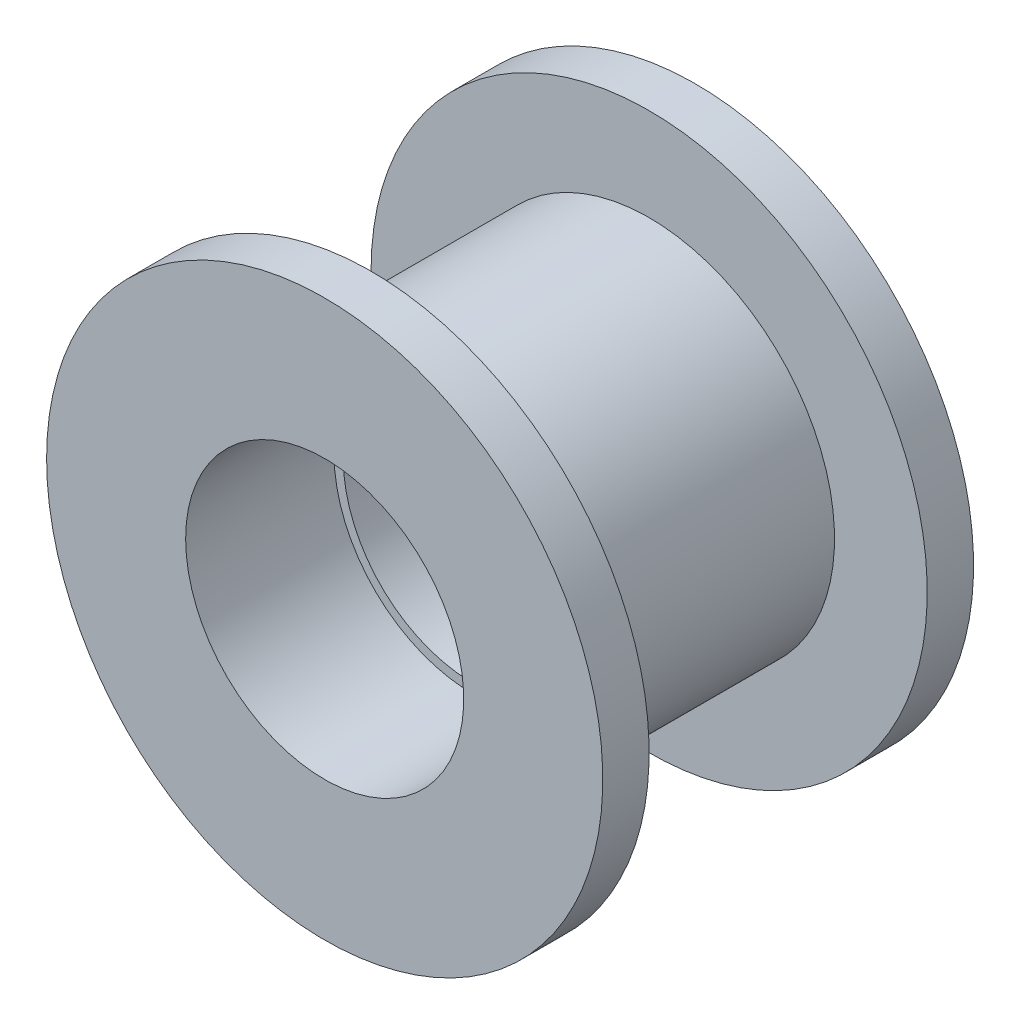
ISO-10303-21;
HEADER;
FILE_DESCRIPTION(('STEP AP214'),'2;1');
FILE_NAME('part.step','',(''),(''),'','','');
FILE_SCHEMA(('AUTOMOTIVE_DESIGN { 1 0 10303 214 1 1 1 1 }'));
ENDSEC;
DATA;
#1=APPLICATION_CONTEXT('core data for automotive mechanical design processes');
#2=APPLICATION_PROTOCOL_DEFINITION('international standard','automotive_design',2000,#1);
#3=PRODUCT_CONTEXT('',#1,'mechanical');
#4=PRODUCT('Part','Part','',(#3));
#5=PRODUCT_RELATED_PRODUCT_CATEGORY('part','',(#4));
#6=PRODUCT_DEFINITION_FORMATION('','',#4);
#7=PRODUCT_DEFINITION_CONTEXT('part definition',#1,'design');
#8=PRODUCT_DEFINITION('design','',#6,#7);
#9=PRODUCT_DEFINITION_SHAPE('','',#8);
#10=(LENGTH_UNIT() NAMED_UNIT(*) SI_UNIT(.MILLI.,.METRE.));
#11=(NAMED_UNIT(*) PLANE_ANGLE_UNIT() SI_UNIT($,.RADIAN.));
#12=(NAMED_UNIT(*) SI_UNIT($,.STERADIAN.) SOLID_ANGLE_UNIT());
#13=UNCERTAINTY_MEASURE_WITH_UNIT(LENGTH_MEASURE(1.E-05),#10,'distance_accuracy_value','');
#14=(GEOMETRIC_REPRESENTATION_CONTEXT(3) GLOBAL_UNCERTAINTY_ASSIGNED_CONTEXT((#13)) GLOBAL_UNIT_ASSIGNED_CONTEXT((#10,
#11,#12)) REPRESENTATION_CONTEXT('',''));
#15=CARTESIAN_POINT('',(0.,0.,0.));
#16=DIRECTION('',(0.,0.,1.));
#17=DIRECTION('',(1.,0.,0.));
#18=AXIS2_PLACEMENT_3D('',#15,#16,#17);
#19=CARTESIAN_POINT('',(0.,0.,-89.8571428571429));
#20=DIRECTION('',(0.,0.,-1.));
#21=DIRECTION('',(-1.,0.,0.));
#22=AXIS2_PLACEMENT_3D('',#19,#20,#21);
#23=CYLINDRICAL_SURFACE('',#22,14.);
#24=CARTESIAN_POINT('',(0.,0.,-16.));
#25=DIRECTION('',(0.,0.,-1.));
#26=DIRECTION('',(-1.,0.,0.));
#27=AXIS2_PLACEMENT_3D('',#24,#25,#26);
#28=CIRCLE('',#27,14.);
#29=CARTESIAN_POINT('',(-14.,0.,-16.));
#30=VERTEX_POINT('',#29);
#31=EDGE_CURVE('E11',#30,#30,#28,.T.);
#32=ORIENTED_EDGE('',*,*,#31,.F.);
#33=EDGE_LOOP('',(#32));
#34=FACE_BOUND('',#33,.T.);
#35=DIRECTION('',(0.,0.,-1.));
#36=VECTOR('',#35,1.);
#37=CARTESIAN_POINT('',(-4.,13.4164078649987,-24.));
#38=LINE('',#37,#36);
#39=CARTESIAN_POINT('',(-4.,13.4164078649987,-24.));
#40=VERTEX_POINT('',#39);
#41=CARTESIAN_POINT('',(-4.,13.4164078649987,-40.));
#42=VERTEX_POINT('',#41);
#43=EDGE_CURVE('E99',#40,#42,#38,.T.);
#44=ORIENTED_EDGE('',*,*,#43,.F.);
#45=CARTESIAN_POINT('',(0.,0.,-24.));
#46=DIRECTION('',(0.,0.,-1.));
#47=DIRECTION('',(-1.,0.,0.));
#48=AXIS2_PLACEMENT_3D('',#45,#46,#47);
#49=CIRCLE('',#48,14.);
#50=CARTESIAN_POINT('',(4.,13.4164078649987,-24.));
#51=VERTEX_POINT('',#50);
#52=EDGE_CURVE('E102',#51,#40,#49,.F.);
#53=ORIENTED_EDGE('',*,*,#52,.F.);
#54=DIRECTION('',(0.,0.,-1.));
#55=VECTOR('',#54,1.);
#56=CARTESIAN_POINT('',(4.,13.4164078649987,-24.));
#57=LINE('',#56,#55);
#58=CARTESIAN_POINT('',(4.,13.4164078649987,-40.));
#59=VERTEX_POINT('',#58);
#60=EDGE_CURVE('E88',#51,#59,#57,.T.);
#61=ORIENTED_EDGE('',*,*,#60,.T.);
#62=CARTESIAN_POINT('',(0.,0.,-40.));
#63=DIRECTION('',(0.,0.,-1.));
#64=DIRECTION('',(-1.,0.,0.));
#65=AXIS2_PLACEMENT_3D('',#62,#63,#64);
#66=CIRCLE('',#65,14.);
#67=EDGE_CURVE('E48',#59,#42,#66,.T.);
#68=ORIENTED_EDGE('',*,*,#67,.T.);
#69=EDGE_LOOP('',(#44,#53,#61,#68));
#70=FACE_BOUND('',#69,.T.);
#71=ADVANCED_FACE('F39',(#34,#70),#23,.F.);
#72=CARTESIAN_POINT('',(30.,0.,-40.));
#73=DIRECTION('',(0.,0.,1.));
#74=DIRECTION('',(1.,0.,0.));
#75=AXIS2_PLACEMENT_3D('',#72,#73,#74);
#76=PLANE('',#75);
#77=CARTESIAN_POINT('',(0.,0.,-40.));
#78=DIRECTION('',(0.,0.,-1.));
#79=DIRECTION('',(-1.,0.,0.));
#80=AXIS2_PLACEMENT_3D('',#77,#78,#79);
#81=CIRCLE('',#80,30.);
#82=CARTESIAN_POINT('',(-30.,0.,-40.));
#83=VERTEX_POINT('',#82);
#84=EDGE_CURVE('E154',#83,#83,#81,.T.);
#85=ORIENTED_EDGE('',*,*,#84,.T.);
#86=EDGE_LOOP('',(#85));
#87=FACE_BOUND('',#86,.T.);
#88=DIRECTION('',(0.,-1.,0.));
#89=VECTOR('',#88,1.);
#90=CARTESIAN_POINT('',(-4.,0.,-40.));
#91=LINE('',#90,#89);
#92=CARTESIAN_POINT('',(-4.,17.3,-40.));
#93=VERTEX_POINT('',#92);
#94=EDGE_CURVE('E81',#93,#42,#91,.T.);
#95=ORIENTED_EDGE('',*,*,#94,.T.);
#96=ORIENTED_EDGE('',*,*,#67,.F.);
#97=DIRECTION('',(0.,-1.,0.));
#98=VECTOR('',#97,1.);
#99=CARTESIAN_POINT('',(4.,0.,-40.));
#100=LINE('',#99,#98);
#101=CARTESIAN_POINT('',(4.,17.3,-40.));
#102=VERTEX_POINT('',#101);
#103=EDGE_CURVE('E93',#102,#59,#100,.T.);
#104=ORIENTED_EDGE('',*,*,#103,.F.);
#105=DIRECTION('',(-1.,0.,0.));
#106=VECTOR('',#105,1.);
#107=CARTESIAN_POINT('',(0.,17.3,-40.));
#108=LINE('',#107,#106);
#109=EDGE_CURVE('E55',#102,#93,#108,.T.);
#110=ORIENTED_EDGE('',*,*,#109,.T.);
#111=EDGE_LOOP('',(#95,#96,#104,#110));
#112=FACE_BOUND('',#111,.T.);
#113=ADVANCED_FACE('F159',(#87,#112),#76,.F.);
#114=CARTESIAN_POINT('',(14.,0.,-16.));
#115=DIRECTION('',(0.,0.,-1.));
#116=DIRECTION('',(-1.,0.,0.));
#117=AXIS2_PLACEMENT_3D('',#114,#115,#116);
#118=PLANE('',#117);
#119=CARTESIAN_POINT('',(0.,0.,-16.));
#120=DIRECTION('',(0.,0.,-1.));
#121=DIRECTION('',(-1.,0.,0.));
#122=AXIS2_PLACEMENT_3D('',#119,#120,#121);
#123=CIRCLE('',#122,15.);
#124=CARTESIAN_POINT('',(-15.,0.,-16.));
#125=VERTEX_POINT('',#124);
#126=EDGE_CURVE('E122',#125,#125,#123,.T.);
#127=ORIENTED_EDGE('',*,*,#126,.F.);
#128=EDGE_LOOP('',(#127));
#129=FACE_BOUND('',#128,.T.);
#130=ORIENTED_EDGE('',*,*,#31,.T.);
#131=EDGE_LOOP('',(#130));
#132=FACE_BOUND('',#131,.T.);
#133=ADVANCED_FACE('F41',(#129,#132),#118,.F.);
#134=CARTESIAN_POINT('',(0.,0.,-89.8571428571429));
#135=DIRECTION('',(0.,0.,-1.));
#136=DIRECTION('',(-1.,0.,0.));
#137=AXIS2_PLACEMENT_3D('',#134,#135,#136);
#138=CYLINDRICAL_SURFACE('',#137,30.);
#139=ORIENTED_EDGE('',*,*,#84,.F.);
#140=EDGE_LOOP('',(#139));
#141=FACE_BOUND('',#140,.T.);
#142=CARTESIAN_POINT('',(0.,0.,-35.));
#143=DIRECTION('',(0.,0.,-1.));
#144=DIRECTION('',(-1.,0.,0.));
#145=AXIS2_PLACEMENT_3D('',#142,#143,#144);
#146=CIRCLE('',#145,30.);
#147=CARTESIAN_POINT('',(-30.,0.,-35.));
#148=VERTEX_POINT('',#147);
#149=EDGE_CURVE('E150',#148,#148,#146,.T.);
#150=ORIENTED_EDGE('',*,*,#149,.T.);
#151=EDGE_LOOP('',(#150));
#152=FACE_BOUND('',#151,.T.);
#153=ADVANCED_FACE('F167',(#141,#152),#138,.T.);
#154=CARTESIAN_POINT('',(20.,0.,-35.));
#155=DIRECTION('',(0.,0.,-1.));
#156=DIRECTION('',(-1.,0.,0.));
#157=AXIS2_PLACEMENT_3D('',#154,#155,#156);
#158=PLANE('',#157);
#159=ORIENTED_EDGE('',*,*,#149,.F.);
#160=EDGE_LOOP('',(#159));
#161=FACE_BOUND('',#160,.T.);
#162=CARTESIAN_POINT('',(0.,0.,-35.));
#163=DIRECTION('',(0.,0.,-1.));
#164=DIRECTION('',(-1.,0.,0.));
#165=AXIS2_PLACEMENT_3D('',#162,#163,#164);
#166=CIRCLE('',#165,20.);
#167=CARTESIAN_POINT('',(-20.,0.,-35.));
#168=VERTEX_POINT('',#167);
#169=EDGE_CURVE('E146',#168,#168,#166,.T.);
#170=ORIENTED_EDGE('',*,*,#169,.T.);
#171=EDGE_LOOP('',(#170));
#172=FACE_BOUND('',#171,.T.);
#173=ADVANCED_FACE('F173',(#161,#172),#158,.F.);
#174=CARTESIAN_POINT('',(0.,0.,-89.8571428571429));
#175=DIRECTION('',(0.,0.,-1.));
#176=DIRECTION('',(-1.,0.,0.));
#177=AXIS2_PLACEMENT_3D('',#174,#175,#176);
#178=CYLINDRICAL_SURFACE('',#177,20.);
#179=ORIENTED_EDGE('',*,*,#169,.F.);
#180=EDGE_LOOP('',(#179));
#181=FACE_BOUND('',#180,.T.);
#182=CARTESIAN_POINT('',(0.,0.,-5.));
#183=DIRECTION('',(0.,0.,-1.));
#184=DIRECTION('',(-1.,0.,0.));
#185=AXIS2_PLACEMENT_3D('',#182,#183,#184);
#186=CIRCLE('',#185,20.);
#187=CARTESIAN_POINT('',(-20.,0.,-5.));
#188=VERTEX_POINT('',#187);
#189=EDGE_CURVE('E142',#188,#188,#186,.T.);
#190=ORIENTED_EDGE('',*,*,#189,.T.);
#191=EDGE_LOOP('',(#190));
#192=FACE_BOUND('',#191,.T.);
#193=ADVANCED_FACE('F177',(#181,#192),#178,.T.);
#194=CARTESIAN_POINT('',(30.,0.,-5.));
#195=DIRECTION('',(0.,0.,1.));
#196=DIRECTION('',(1.,0.,0.));
#197=AXIS2_PLACEMENT_3D('',#194,#195,#196);
#198=PLANE('',#197);
#199=ORIENTED_EDGE('',*,*,#189,.F.);
#200=EDGE_LOOP('',(#199));
#201=FACE_BOUND('',#200,.T.);
#202=CARTESIAN_POINT('',(0.,0.,-5.));
#203=DIRECTION('',(0.,0.,-1.));
#204=DIRECTION('',(-1.,0.,0.));
#205=AXIS2_PLACEMENT_3D('',#202,#203,#204);
#206=CIRCLE('',#205,30.);
#207=CARTESIAN_POINT('',(-30.,0.,-5.));
#208=VERTEX_POINT('',#207);
#209=EDGE_CURVE('E138',#208,#208,#206,.T.);
#210=ORIENTED_EDGE('',*,*,#209,.T.);
#211=EDGE_LOOP('',(#210));
#212=FACE_BOUND('',#211,.T.);
#213=ADVANCED_FACE('F181',(#201,#212),#198,.F.);
#214=CARTESIAN_POINT('',(0.,0.,-89.8571428571429));
#215=DIRECTION('',(0.,0.,-1.));
#216=DIRECTION('',(-1.,0.,0.));
#217=AXIS2_PLACEMENT_3D('',#214,#215,#216);
#218=CYLINDRICAL_SURFACE('',#217,30.);
#219=ORIENTED_EDGE('',*,*,#209,.F.);
#220=EDGE_LOOP('',(#219));
#221=FACE_BOUND('',#220,.T.);
#222=CARTESIAN_POINT('',(0.,0.,0.));
#223=DIRECTION('',(0.,0.,-1.));
#224=DIRECTION('',(-1.,0.,0.));
#225=AXIS2_PLACEMENT_3D('',#222,#223,#224);
#226=CIRCLE('',#225,30.);
#227=CARTESIAN_POINT('',(-30.,0.,0.));
#228=VERTEX_POINT('',#227);
#229=EDGE_CURVE('E134',#228,#228,#226,.T.);
#230=ORIENTED_EDGE('',*,*,#229,.T.);
#231=EDGE_LOOP('',(#230));
#232=FACE_BOUND('',#231,.T.);
#233=ADVANCED_FACE('F185',(#221,#232),#218,.T.);
#234=CARTESIAN_POINT('',(15.,0.,0.));
#235=DIRECTION('',(0.,0.,-1.));
#236=DIRECTION('',(-1.,0.,0.));
#237=AXIS2_PLACEMENT_3D('',#234,#235,#236);
#238=PLANE('',#237);
#239=ORIENTED_EDGE('',*,*,#229,.F.);
#240=EDGE_LOOP('',(#239));
#241=FACE_BOUND('',#240,.T.);
#242=CARTESIAN_POINT('',(0.,0.,0.));
#243=DIRECTION('',(0.,0.,-1.));
#244=DIRECTION('',(-1.,0.,0.));
#245=AXIS2_PLACEMENT_3D('',#242,#243,#244);
#246=CIRCLE('',#245,15.);
#247=CARTESIAN_POINT('',(-15.,0.,0.));
#248=VERTEX_POINT('',#247);
#249=EDGE_CURVE('E130',#248,#248,#246,.T.);
#250=ORIENTED_EDGE('',*,*,#249,.T.);
#251=EDGE_LOOP('',(#250));
#252=FACE_BOUND('',#251,.T.);
#253=ADVANCED_FACE('F189',(#241,#252),#238,.F.);
#254=CARTESIAN_POINT('',(0.,0.,-89.8571428571429));
#255=DIRECTION('',(0.,0.,-1.));
#256=DIRECTION('',(-1.,0.,0.));
#257=AXIS2_PLACEMENT_3D('',#254,#255,#256);
#258=CYLINDRICAL_SURFACE('',#257,15.);
#259=ORIENTED_EDGE('',*,*,#249,.F.);
#260=EDGE_LOOP('',(#259));
#261=FACE_BOUND('',#260,.T.);
#262=ORIENTED_EDGE('',*,*,#126,.T.);
#263=EDGE_LOOP('',(#262));
#264=FACE_BOUND('',#263,.T.);
#265=ADVANCED_FACE('F193',(#261,#264),#258,.F.);
#266=CARTESIAN_POINT('',(0.,17.3,-24.));
#267=DIRECTION('',(0.,-1.,0.));
#268=DIRECTION('',(0.,0.,-1.));
#269=AXIS2_PLACEMENT_3D('',#266,#267,#268);
#270=PLANE('',#269);
#271=ORIENTED_EDGE('',*,*,#109,.F.);
#272=DIRECTION('',(0.,0.,-1.));
#273=VECTOR('',#272,1.);
#274=CARTESIAN_POINT('',(4.,17.3,-24.));
#275=LINE('',#274,#273);
#276=CARTESIAN_POINT('',(4.,17.3,-24.));
#277=VERTEX_POINT('',#276);
#278=EDGE_CURVE('E83',#277,#102,#275,.T.);
#279=ORIENTED_EDGE('',*,*,#278,.F.);
#280=DIRECTION('',(-1.,0.,0.));
#281=VECTOR('',#280,1.);
#282=CARTESIAN_POINT('',(0.,17.3,-24.));
#283=LINE('',#282,#281);
#284=CARTESIAN_POINT('',(-4.,17.3,-24.));
#285=VERTEX_POINT('',#284);
#286=EDGE_CURVE('E104',#277,#285,#283,.T.);
#287=ORIENTED_EDGE('',*,*,#286,.T.);
#288=DIRECTION('',(0.,0.,-1.));
#289=VECTOR('',#288,1.);
#290=CARTESIAN_POINT('',(-4.,17.3,-24.));
#291=LINE('',#290,#289);
#292=EDGE_CURVE('E119',#285,#93,#291,.T.);
#293=ORIENTED_EDGE('',*,*,#292,.T.);
#294=EDGE_LOOP('',(#271,#279,#287,#293));
#295=FACE_BOUND('',#294,.T.);
#296=ADVANCED_FACE('F197',(#295),#270,.T.);
#297=CARTESIAN_POINT('',(-4.,0.,-24.));
#298=DIRECTION('',(1.,0.,0.));
#299=DIRECTION('',(0.,0.,-1.));
#300=AXIS2_PLACEMENT_3D('',#297,#298,#299);
#301=PLANE('',#300);
#302=ORIENTED_EDGE('',*,*,#94,.F.);
#303=ORIENTED_EDGE('',*,*,#292,.F.);
#304=DIRECTION('',(0.,-1.,0.));
#305=VECTOR('',#304,1.);
#306=CARTESIAN_POINT('',(-4.,0.,-24.));
#307=LINE('',#306,#305);
#308=EDGE_CURVE('E64',#285,#40,#307,.T.);
#309=ORIENTED_EDGE('',*,*,#308,.T.);
#310=ORIENTED_EDGE('',*,*,#43,.T.);
#311=EDGE_LOOP('',(#302,#303,#309,#310));
#312=FACE_BOUND('',#311,.T.);
#313=ADVANCED_FACE('F201',(#312),#301,.T.);
#314=CARTESIAN_POINT('',(4.,0.,-24.));
#315=DIRECTION('',(1.,0.,0.));
#316=DIRECTION('',(0.,0.,-1.));
#317=AXIS2_PLACEMENT_3D('',#314,#315,#316);
#318=PLANE('',#317);
#319=ORIENTED_EDGE('',*,*,#103,.T.);
#320=ORIENTED_EDGE('',*,*,#60,.F.);
#321=DIRECTION('',(0.,-1.,0.));
#322=VECTOR('',#321,1.);
#323=CARTESIAN_POINT('',(4.,0.,-24.));
#324=LINE('',#323,#322);
#325=EDGE_CURVE('E91',#277,#51,#324,.T.);
#326=ORIENTED_EDGE('',*,*,#325,.F.);
#327=ORIENTED_EDGE('',*,*,#278,.T.);
#328=EDGE_LOOP('',(#319,#320,#326,#327));
#329=FACE_BOUND('',#328,.T.);
#330=ADVANCED_FACE('F90',(#329),#318,.F.);
#331=CARTESIAN_POINT('',(0.,0.,-24.));
#332=DIRECTION('',(0.,0.,-1.));
#333=DIRECTION('',(-1.,0.,0.));
#334=AXIS2_PLACEMENT_3D('',#331,#332,#333);
#335=PLANE('',#334);
#336=ORIENTED_EDGE('',*,*,#286,.F.);
#337=ORIENTED_EDGE('',*,*,#325,.T.);
#338=ORIENTED_EDGE('',*,*,#52,.T.);
#339=ORIENTED_EDGE('',*,*,#308,.F.);
#340=EDGE_LOOP('',(#336,#337,#338,#339));
#341=FACE_BOUND('',#340,.T.);
#342=ADVANCED_FACE('F101',(#341),#335,.T.);
#343=CLOSED_SHELL('',(#71,#113,#133,#153,#173,#193,#213,#233,#253,#265,#296,#313,#330,#342));
#344=MANIFOLD_SOLID_BREP('B2',#343);
#345=ADVANCED_BREP_SHAPE_REPRESENTATION('',(#18,#344),#14);
#346=SHAPE_DEFINITION_REPRESENTATION(#9,#345);
ENDSEC;
END-ISO-10303-21;
